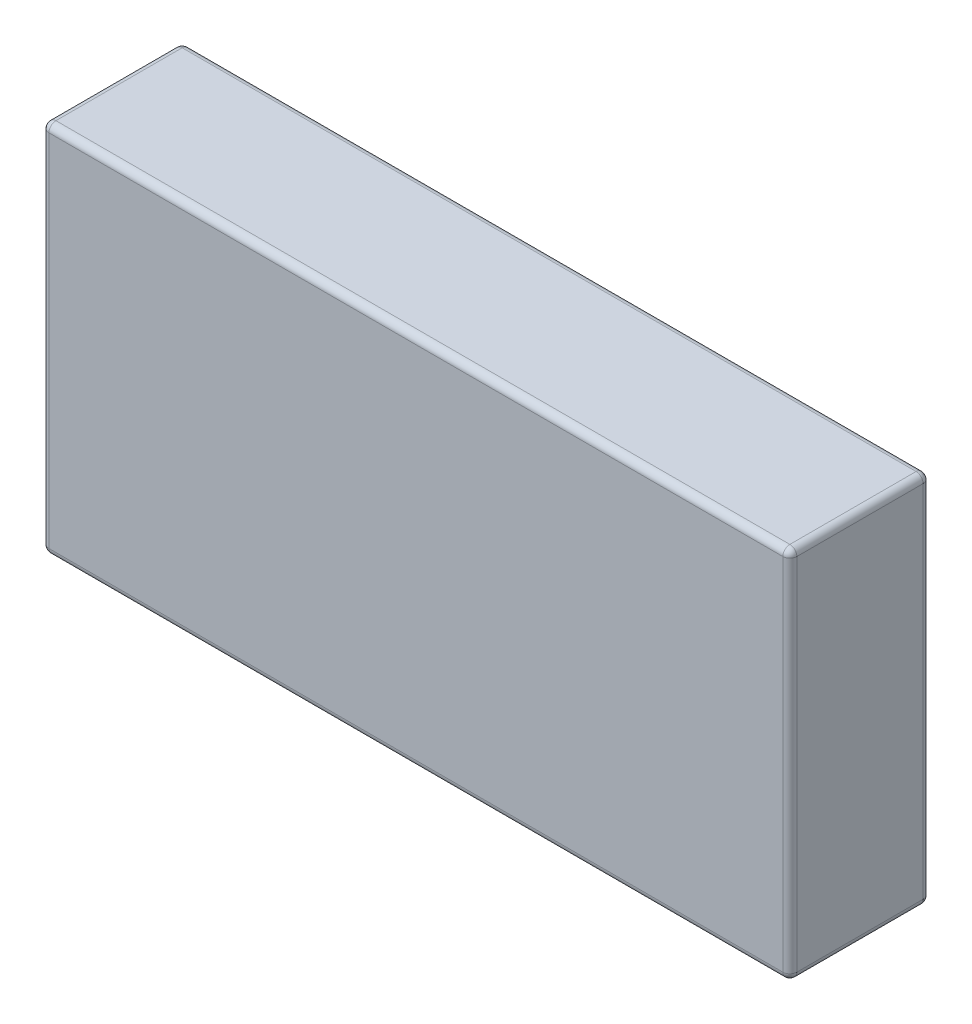
ISO-10303-21;
HEADER;
FILE_DESCRIPTION(('STEP AP214'),'2;1');
FILE_NAME('part.step','',(''),(''),'','','');
FILE_SCHEMA(('AUTOMOTIVE_DESIGN { 1 0 10303 214 1 1 1 1 }'));
ENDSEC;
DATA;
#1=APPLICATION_CONTEXT('core data for automotive mechanical design processes');
#2=APPLICATION_PROTOCOL_DEFINITION('international standard','automotive_design',2000,#1);
#3=PRODUCT_CONTEXT('',#1,'mechanical');
#4=PRODUCT('Part','Part','',(#3));
#5=PRODUCT_RELATED_PRODUCT_CATEGORY('part','',(#4));
#6=PRODUCT_DEFINITION_FORMATION('','',#4);
#7=PRODUCT_DEFINITION_CONTEXT('part definition',#1,'design');
#8=PRODUCT_DEFINITION('design','',#6,#7);
#9=PRODUCT_DEFINITION_SHAPE('','',#8);
#10=(LENGTH_UNIT() NAMED_UNIT(*) SI_UNIT(.MILLI.,.METRE.));
#11=(NAMED_UNIT(*) PLANE_ANGLE_UNIT() SI_UNIT($,.RADIAN.));
#12=(NAMED_UNIT(*) SI_UNIT($,.STERADIAN.) SOLID_ANGLE_UNIT());
#13=UNCERTAINTY_MEASURE_WITH_UNIT(LENGTH_MEASURE(1.E-05),#10,'distance_accuracy_value','');
#14=(GEOMETRIC_REPRESENTATION_CONTEXT(3) GLOBAL_UNCERTAINTY_ASSIGNED_CONTEXT((#13)) GLOBAL_UNIT_ASSIGNED_CONTEXT((#10,
#11,#12)) REPRESENTATION_CONTEXT('',''));
#15=CARTESIAN_POINT('',(0.,0.,0.));
#16=DIRECTION('',(0.,0.,1.));
#17=DIRECTION('',(1.,0.,0.));
#18=AXIS2_PLACEMENT_3D('',#15,#16,#17);
#19=CARTESIAN_POINT('',(-0.784999999999999,0.384999999999998,0.0150000000000006));
#20=DIRECTION('',(1.,0.,0.));
#21=DIRECTION('',(0.,0.,-1.));
#22=AXIS2_PLACEMENT_3D('',#19,#20,#21);
#23=SPHERICAL_SURFACE('',#22,0.0150000000000025);
#24=CARTESIAN_POINT('',(-0.784999999999998,0.385,0.0150000000000019));
#25=DIRECTION('',(0.,1.,0.));
#26=DIRECTION('',(0.,0.,1.));
#27=AXIS2_PLACEMENT_3D('',#24,#25,#26);
#28=CIRCLE('',#27,0.0150000000000028);
#29=CARTESIAN_POINT('',(-0.800000000000001,0.384999999999999,0.0150000000000003));
#30=VERTEX_POINT('',#29);
#31=CARTESIAN_POINT('',(-0.785,0.385,0.));
#32=VERTEX_POINT('',#31);
#33=EDGE_CURVE('E160',#30,#32,#28,.F.);
#34=ORIENTED_EDGE('',*,*,#33,.F.);
#35=CARTESIAN_POINT('',(-0.785,0.385,0.015));
#36=DIRECTION('',(0.,0.,1.));
#37=DIRECTION('',(1.,0.,0.));
#38=AXIS2_PLACEMENT_3D('',#35,#36,#37);
#39=CIRCLE('',#38,0.0150000000000007);
#40=CARTESIAN_POINT('',(-0.785,0.4,0.0149999999995748));
#41=VERTEX_POINT('',#40);
#42=EDGE_CURVE('E278',#41,#30,#39,.T.);
#43=ORIENTED_EDGE('',*,*,#42,.F.);
#44=CARTESIAN_POINT('',(-0.785,0.385000000000001,0.0149999999999986));
#45=DIRECTION('',(1.,0.,0.));
#46=DIRECTION('',(0.,0.,-1.));
#47=AXIS2_PLACEMENT_3D('',#44,#45,#46);
#48=CIRCLE('',#47,0.0149999999999985);
#49=EDGE_CURVE('E284',#32,#41,#48,.T.);
#50=ORIENTED_EDGE('',*,*,#49,.F.);
#51=EDGE_LOOP('',(#34,#43,#50));
#52=FACE_BOUND('',#51,.T.);
#53=ADVANCED_FACE('F17',(#52),#23,.T.);
#54=CARTESIAN_POINT('',(0.785000000000001,0.385,0.0149999999999997));
#55=DIRECTION('',(1.,0.,0.));
#56=DIRECTION('',(0.,0.,-1.));
#57=AXIS2_PLACEMENT_3D('',#54,#55,#56);
#58=SPHERICAL_SURFACE('',#57,0.0149999999999998);
#59=CARTESIAN_POINT('',(0.784999999999998,0.385,0.0150000000000019));
#60=DIRECTION('',(0.,-1.,0.));
#61=DIRECTION('',(0.,0.,-1.));
#62=AXIS2_PLACEMENT_3D('',#59,#60,#61);
#63=CIRCLE('',#62,0.0150000000000028);
#64=CARTESIAN_POINT('',(0.784999999999999,0.385,0.));
#65=VERTEX_POINT('',#64);
#66=CARTESIAN_POINT('',(0.800000000000001,0.385000000000001,0.0149999999999998));
#67=VERTEX_POINT('',#66);
#68=EDGE_CURVE('E113',#65,#67,#63,.T.);
#69=ORIENTED_EDGE('',*,*,#68,.F.);
#70=CARTESIAN_POINT('',(0.785,0.385000000000001,0.0149999999999986));
#71=DIRECTION('',(1.,0.,0.));
#72=DIRECTION('',(0.,0.,-1.));
#73=AXIS2_PLACEMENT_3D('',#70,#71,#72);
#74=CIRCLE('',#73,0.0149999999999985);
#75=CARTESIAN_POINT('',(0.784999999999999,0.4,0.015));
#76=VERTEX_POINT('',#75);
#77=EDGE_CURVE('E281',#76,#65,#74,.F.);
#78=ORIENTED_EDGE('',*,*,#77,.F.);
#79=CARTESIAN_POINT('',(0.785000000000001,0.385000000000001,0.015));
#80=DIRECTION('',(0.,0.,1.));
#81=DIRECTION('',(1.,0.,0.));
#82=AXIS2_PLACEMENT_3D('',#79,#80,#81);
#83=CIRCLE('',#82,0.0149999999999988);
#84=EDGE_CURVE('E275',#67,#76,#83,.T.);
#85=ORIENTED_EDGE('',*,*,#84,.F.);
#86=EDGE_LOOP('',(#69,#78,#85));
#87=FACE_BOUND('',#86,.T.);
#88=ADVANCED_FACE('F162',(#87),#58,.T.);
#89=CARTESIAN_POINT('',(-0.784999999999998,0.385,0.0150000000000019));
#90=DIRECTION('',(0.,1.,0.));
#91=DIRECTION('',(0.,0.,1.));
#92=AXIS2_PLACEMENT_3D('',#89,#90,#91);
#93=CYLINDRICAL_SURFACE('',#92,0.0150000000000028);
#94=ORIENTED_EDGE('',*,*,#33,.T.);
#95=DIRECTION('',(0.,1.,0.));
#96=VECTOR('',#95,1.);
#97=CARTESIAN_POINT('',(-0.785,0.385,0.));
#98=LINE('',#97,#96);
#99=CARTESIAN_POINT('',(-0.785,-0.385000000000402,0.));
#100=VERTEX_POINT('',#99);
#101=EDGE_CURVE('E136',#100,#32,#98,.T.);
#102=ORIENTED_EDGE('',*,*,#101,.F.);
#103=CARTESIAN_POINT('',(-0.784999999999999,-0.384999999999999,0.0150000000000005));
#104=DIRECTION('',(0.,1.,-1.0727817927293E-10));
#105=DIRECTION('',(1.,0.,0.));
#106=AXIS2_PLACEMENT_3D('',#103,#104,#105);
#107=CIRCLE('',#106,0.015000000000001);
#108=CARTESIAN_POINT('',(-0.8,-0.385,0.0150000000000001));
#109=VERTEX_POINT('',#108);
#110=EDGE_CURVE('E138',#109,#100,#107,.F.);
#111=ORIENTED_EDGE('',*,*,#110,.F.);
#112=DIRECTION('',(0.,1.,0.));
#113=VECTOR('',#112,1.);
#114=CARTESIAN_POINT('',(-0.800000000000001,-0.385,0.015));
#115=LINE('',#114,#113);
#116=EDGE_CURVE('E269',#30,#109,#115,.F.);
#117=ORIENTED_EDGE('',*,*,#116,.F.);
#118=EDGE_LOOP('',(#94,#102,#111,#117));
#119=FACE_BOUND('',#118,.T.);
#120=ADVANCED_FACE('F154',(#119),#93,.T.);
#121=CARTESIAN_POINT('',(-0.784999999999999,-0.384999999999999,0.0150000000000005));
#122=DIRECTION('',(1.,0.,0.));
#123=DIRECTION('',(0.,0.,1.));
#124=AXIS2_PLACEMENT_3D('',#121,#122,#123);
#125=SPHERICAL_SURFACE('',#124,0.015000000000001);
#126=CARTESIAN_POINT('',(-0.784999999999999,-0.384999999999999,0.015));
#127=DIRECTION('',(0.,0.,1.));
#128=DIRECTION('',(1.,0.,0.));
#129=AXIS2_PLACEMENT_3D('',#126,#127,#128);
#130=CIRCLE('',#129,0.0150000000000009);
#131=CARTESIAN_POINT('',(-0.785,-0.4,0.015));
#132=VERTEX_POINT('',#131);
#133=EDGE_CURVE('E266',#109,#132,#130,.T.);
#134=ORIENTED_EDGE('',*,*,#133,.F.);
#135=ORIENTED_EDGE('',*,*,#110,.T.);
#136=CARTESIAN_POINT('',(-0.785,-0.385,0.0150000000000006));
#137=DIRECTION('',(-1.,0.,0.));
#138=DIRECTION('',(0.,0.,1.));
#139=AXIS2_PLACEMENT_3D('',#136,#137,#138);
#140=CIRCLE('',#139,0.0150000000000007);
#141=EDGE_CURVE('E124',#132,#100,#140,.F.);
#142=ORIENTED_EDGE('',*,*,#141,.F.);
#143=EDGE_LOOP('',(#134,#135,#142));
#144=FACE_BOUND('',#143,.T.);
#145=ADVANCED_FACE('F151',(#144),#125,.T.);
#146=CARTESIAN_POINT('',(0.4,0.385,0.));
#147=DIRECTION('',(0.,0.,-1.));
#148=DIRECTION('',(-1.,0.,0.));
#149=AXIS2_PLACEMENT_3D('',#146,#147,#148);
#150=PLANE('',#149);
#151=DIRECTION('',(0.,-1.,0.));
#152=VECTOR('',#151,1.);
#153=CARTESIAN_POINT('',(0.784999999999998,-0.385,0.));
#154=LINE('',#153,#152);
#155=CARTESIAN_POINT('',(0.784999999999999,-0.385,0.));
#156=VERTEX_POINT('',#155);
#157=EDGE_CURVE('E105',#156,#65,#154,.F.);
#158=ORIENTED_EDGE('',*,*,#157,.F.);
#159=DIRECTION('',(-1.,0.,0.));
#160=VECTOR('',#159,1.);
#161=CARTESIAN_POINT('',(0.4,-0.385,0.));
#162=LINE('',#161,#160);
#163=EDGE_CURVE('E108',#100,#156,#162,.F.);
#164=ORIENTED_EDGE('',*,*,#163,.F.);
#165=ORIENTED_EDGE('',*,*,#101,.T.);
#166=DIRECTION('',(1.,0.,0.));
#167=VECTOR('',#166,1.);
#168=CARTESIAN_POINT('',(0.785,0.385000000000001,0.));
#169=LINE('',#168,#167);
#170=EDGE_CURVE('E102',#65,#32,#169,.F.);
#171=ORIENTED_EDGE('',*,*,#170,.F.);
#172=EDGE_LOOP('',(#158,#164,#165,#171));
#173=FACE_BOUND('',#172,.T.);
#174=ADVANCED_FACE('F107',(#173),#150,.T.);
#175=CARTESIAN_POINT('',(0.785,-0.384999999999999,0.0150000000000006));
#176=DIRECTION('',(1.,0.,0.));
#177=DIRECTION('',(0.,0.,1.));
#178=AXIS2_PLACEMENT_3D('',#175,#176,#177);
#179=SPHERICAL_SURFACE('',#178,0.015000000000001);
#180=CARTESIAN_POINT('',(0.784999999999997,-0.384999999999997,0.015));
#181=DIRECTION('',(0.,0.,1.));
#182=DIRECTION('',(1.,0.,0.));
#183=AXIS2_PLACEMENT_3D('',#180,#181,#182);
#184=CIRCLE('',#183,0.0150000000000038);
#185=CARTESIAN_POINT('',(0.785,-0.4,0.0149999999995748));
#186=VERTEX_POINT('',#185);
#187=CARTESIAN_POINT('',(0.800000000000001,-0.384999999999999,0.0150000000000003));
#188=VERTEX_POINT('',#187);
#189=EDGE_CURVE('E129',#186,#188,#184,.T.);
#190=ORIENTED_EDGE('',*,*,#189,.F.);
#191=CARTESIAN_POINT('',(0.785,-0.385,0.0150000000000006));
#192=DIRECTION('',(-1.,0.,0.));
#193=DIRECTION('',(0.,0.,1.));
#194=AXIS2_PLACEMENT_3D('',#191,#192,#193);
#195=CIRCLE('',#194,0.0150000000000007);
#196=EDGE_CURVE('E121',#156,#186,#195,.T.);
#197=ORIENTED_EDGE('',*,*,#196,.F.);
#198=CARTESIAN_POINT('',(0.784999999999998,-0.385,0.0150000000000019));
#199=DIRECTION('',(0.,-1.,0.));
#200=DIRECTION('',(0.,0.,-1.));
#201=AXIS2_PLACEMENT_3D('',#198,#199,#200);
#202=CIRCLE('',#201,0.0150000000000028);
#203=EDGE_CURVE('E114',#188,#156,#202,.F.);
#204=ORIENTED_EDGE('',*,*,#203,.F.);
#205=EDGE_LOOP('',(#190,#197,#204));
#206=FACE_BOUND('',#205,.T.);
#207=ADVANCED_FACE('F127',(#206),#179,.T.);
#208=CARTESIAN_POINT('',(0.784999999999998,-0.385,0.0150000000000019));
#209=DIRECTION('',(0.,-1.,0.));
#210=DIRECTION('',(0.,0.,-1.));
#211=AXIS2_PLACEMENT_3D('',#208,#209,#210);
#212=CYLINDRICAL_SURFACE('',#211,0.0150000000000028);
#213=ORIENTED_EDGE('',*,*,#68,.T.);
#214=DIRECTION('',(0.,1.,0.));
#215=VECTOR('',#214,1.);
#216=CARTESIAN_POINT('',(0.800000000000001,0.385,0.015));
#217=LINE('',#216,#215);
#218=EDGE_CURVE('E134',#188,#67,#217,.T.);
#219=ORIENTED_EDGE('',*,*,#218,.F.);
#220=ORIENTED_EDGE('',*,*,#203,.T.);
#221=ORIENTED_EDGE('',*,*,#157,.T.);
#222=EDGE_LOOP('',(#213,#219,#220,#221));
#223=FACE_BOUND('',#222,.T.);
#224=ADVANCED_FACE('F132',(#223),#212,.T.);
#225=CARTESIAN_POINT('',(0.785,0.385000000000001,0.0149999999999986));
#226=DIRECTION('',(1.,0.,0.));
#227=DIRECTION('',(0.,0.,-1.));
#228=AXIS2_PLACEMENT_3D('',#225,#226,#227);
#229=CYLINDRICAL_SURFACE('',#228,0.0149999999999985);
#230=DIRECTION('',(1.,0.,0.));
#231=VECTOR('',#230,1.);
#232=CARTESIAN_POINT('',(-0.785,0.4,0.015));
#233=LINE('',#232,#231);
#234=EDGE_CURVE('E249',#76,#41,#233,.F.);
#235=ORIENTED_EDGE('',*,*,#234,.F.);
#236=ORIENTED_EDGE('',*,*,#77,.T.);
#237=ORIENTED_EDGE('',*,*,#170,.T.);
#238=ORIENTED_EDGE('',*,*,#49,.T.);
#239=EDGE_LOOP('',(#235,#236,#237,#238));
#240=FACE_BOUND('',#239,.T.);
#241=ADVANCED_FACE('F353',(#240),#229,.T.);
#242=CARTESIAN_POINT('',(-0.785,0.385,0.285));
#243=DIRECTION('',(0.,0.,1.));
#244=DIRECTION('',(1.,0.,0.));
#245=AXIS2_PLACEMENT_3D('',#242,#243,#244);
#246=CYLINDRICAL_SURFACE('',#245,0.0150000000000007);
#247=ORIENTED_EDGE('',*,*,#42,.T.);
#248=DIRECTION('',(0.,0.,1.));
#249=VECTOR('',#248,1.);
#250=CARTESIAN_POINT('',(-0.800000000000001,0.385,0.015));
#251=LINE('',#250,#249);
#252=CARTESIAN_POINT('',(-0.800000000000001,0.385,0.285));
#253=VERTEX_POINT('',#252);
#254=EDGE_CURVE('E272',#253,#30,#251,.F.);
#255=ORIENTED_EDGE('',*,*,#254,.F.);
#256=CARTESIAN_POINT('',(-0.785,0.385,0.285));
#257=DIRECTION('',(0.,0.,1.));
#258=DIRECTION('',(1.,0.,0.));
#259=AXIS2_PLACEMENT_3D('',#256,#257,#258);
#260=CIRCLE('',#259,0.0150000000000002);
#261=CARTESIAN_POINT('',(-0.785,0.4,0.285));
#262=VERTEX_POINT('',#261);
#263=EDGE_CURVE('E241',#262,#253,#260,.T.);
#264=ORIENTED_EDGE('',*,*,#263,.F.);
#265=DIRECTION('',(0.,0.,1.));
#266=VECTOR('',#265,1.);
#267=CARTESIAN_POINT('',(-0.785,0.4,0.015));
#268=LINE('',#267,#266);
#269=EDGE_CURVE('E246',#41,#262,#268,.T.);
#270=ORIENTED_EDGE('',*,*,#269,.F.);
#271=EDGE_LOOP('',(#247,#255,#264,#270));
#272=FACE_BOUND('',#271,.T.);
#273=ADVANCED_FACE('F357',(#272),#246,.T.);
#274=CARTESIAN_POINT('',(0.785000000000001,0.385000000000001,0.285));
#275=DIRECTION('',(0.,0.,1.));
#276=DIRECTION('',(1.,0.,0.));
#277=AXIS2_PLACEMENT_3D('',#274,#275,#276);
#278=CYLINDRICAL_SURFACE('',#277,0.0149999999999988);
#279=ORIENTED_EDGE('',*,*,#84,.T.);
#280=DIRECTION('',(0.,0.,1.));
#281=VECTOR('',#280,1.);
#282=CARTESIAN_POINT('',(0.785,0.4,0.015));
#283=LINE('',#282,#281);
#284=CARTESIAN_POINT('',(0.785,0.4,0.285));
#285=VERTEX_POINT('',#284);
#286=EDGE_CURVE('E252',#285,#76,#283,.F.);
#287=ORIENTED_EDGE('',*,*,#286,.F.);
#288=CARTESIAN_POINT('',(0.785,0.384999999999999,0.285));
#289=DIRECTION('',(0.,0.,1.));
#290=DIRECTION('',(1.,0.,0.));
#291=AXIS2_PLACEMENT_3D('',#288,#289,#290);
#292=CIRCLE('',#291,0.0150000000000009);
#293=CARTESIAN_POINT('',(0.8,0.385,0.285));
#294=VERTEX_POINT('',#293);
#295=EDGE_CURVE('E239',#294,#285,#292,.T.);
#296=ORIENTED_EDGE('',*,*,#295,.F.);
#297=DIRECTION('',(0.,0.,-1.));
#298=VECTOR('',#297,1.);
#299=CARTESIAN_POINT('',(0.800000000000001,0.385,0.015));
#300=LINE('',#299,#298);
#301=EDGE_CURVE('E255',#67,#294,#300,.F.);
#302=ORIENTED_EDGE('',*,*,#301,.F.);
#303=EDGE_LOOP('',(#279,#287,#296,#302));
#304=FACE_BOUND('',#303,.T.);
#305=ADVANCED_FACE('F290',(#304),#278,.T.);
#306=CARTESIAN_POINT('',(-0.800000000000001,-0.385,0.015));
#307=DIRECTION('',(-1.,0.,0.));
#308=DIRECTION('',(0.,0.,1.));
#309=AXIS2_PLACEMENT_3D('',#306,#307,#308);
#310=PLANE('',#309);
#311=ORIENTED_EDGE('',*,*,#116,.T.);
#312=DIRECTION('',(0.,0.,1.));
#313=VECTOR('',#312,1.);
#314=CARTESIAN_POINT('',(-0.8,-0.385,0.285));
#315=LINE('',#314,#313);
#316=CARTESIAN_POINT('',(-0.800000000000001,-0.385,0.285));
#317=VERTEX_POINT('',#316);
#318=EDGE_CURVE('E263',#317,#109,#315,.F.);
#319=ORIENTED_EDGE('',*,*,#318,.F.);
#320=DIRECTION('',(0.,-1.,0.));
#321=VECTOR('',#320,1.);
#322=CARTESIAN_POINT('',(-0.800000000000001,-0.385,0.285));
#323=LINE('',#322,#321);
#324=EDGE_CURVE('E340',#253,#317,#323,.T.);
#325=ORIENTED_EDGE('',*,*,#324,.F.);
#326=ORIENTED_EDGE('',*,*,#254,.T.);
#327=EDGE_LOOP('',(#311,#319,#325,#326));
#328=FACE_BOUND('',#327,.T.);
#329=ADVANCED_FACE('F359',(#328),#310,.T.);
#330=CARTESIAN_POINT('',(-0.784999999999999,-0.384999999999999,0.285));
#331=DIRECTION('',(0.,0.,1.));
#332=DIRECTION('',(1.,0.,0.));
#333=AXIS2_PLACEMENT_3D('',#330,#331,#332);
#334=CYLINDRICAL_SURFACE('',#333,0.0150000000000009);
#335=CARTESIAN_POINT('',(-0.784999999999999,-0.384999999999999,0.285));
#336=DIRECTION('',(0.,0.,-1.));
#337=DIRECTION('',(1.,0.,0.));
#338=AXIS2_PLACEMENT_3D('',#335,#336,#337);
#339=CIRCLE('',#338,0.0150000000000015);
#340=CARTESIAN_POINT('',(-0.785,-0.4,0.285));
#341=VERTEX_POINT('',#340);
#342=EDGE_CURVE('E344',#317,#341,#339,.F.);
#343=ORIENTED_EDGE('',*,*,#342,.F.);
#344=ORIENTED_EDGE('',*,*,#318,.T.);
#345=ORIENTED_EDGE('',*,*,#133,.T.);
#346=DIRECTION('',(0.,0.,-1.));
#347=VECTOR('',#346,1.);
#348=CARTESIAN_POINT('',(-0.785,-0.4,0.015));
#349=LINE('',#348,#347);
#350=EDGE_CURVE('E211',#341,#132,#349,.T.);
#351=ORIENTED_EDGE('',*,*,#350,.F.);
#352=EDGE_LOOP('',(#343,#344,#345,#351));
#353=FACE_BOUND('',#352,.T.);
#354=ADVANCED_FACE('F347',(#353),#334,.T.);
#355=CARTESIAN_POINT('',(0.4,-0.385,0.0150000000000006));
#356=DIRECTION('',(-1.,0.,0.));
#357=DIRECTION('',(0.,0.,1.));
#358=AXIS2_PLACEMENT_3D('',#355,#356,#357);
#359=CYLINDRICAL_SURFACE('',#358,0.0150000000000007);
#360=ORIENTED_EDGE('',*,*,#163,.T.);
#361=ORIENTED_EDGE('',*,*,#196,.T.);
#362=DIRECTION('',(1.,0.,0.));
#363=VECTOR('',#362,1.);
#364=CARTESIAN_POINT('',(0.785,-0.4,0.015));
#365=LINE('',#364,#363);
#366=EDGE_CURVE('E208',#132,#186,#365,.T.);
#367=ORIENTED_EDGE('',*,*,#366,.F.);
#368=ORIENTED_EDGE('',*,*,#141,.T.);
#369=EDGE_LOOP('',(#360,#361,#367,#368));
#370=FACE_BOUND('',#369,.T.);
#371=ADVANCED_FACE('F120',(#370),#359,.T.);
#372=CARTESIAN_POINT('',(0.784999999999997,-0.384999999999997,0.285));
#373=DIRECTION('',(0.,0.,1.));
#374=DIRECTION('',(1.,0.,0.));
#375=AXIS2_PLACEMENT_3D('',#372,#373,#374);
#376=CYLINDRICAL_SURFACE('',#375,0.0150000000000038);
#377=ORIENTED_EDGE('',*,*,#189,.T.);
#378=DIRECTION('',(0.,0.,-1.));
#379=VECTOR('',#378,1.);
#380=CARTESIAN_POINT('',(0.800000000000001,-0.385,0.015));
#381=LINE('',#380,#379);
#382=CARTESIAN_POINT('',(0.800000000000001,-0.384999999999998,0.285));
#383=VERTEX_POINT('',#382);
#384=EDGE_CURVE('E259',#383,#188,#381,.T.);
#385=ORIENTED_EDGE('',*,*,#384,.F.);
#386=CARTESIAN_POINT('',(0.785,-0.384999999999999,0.284999999999999));
#387=DIRECTION('',(0.,0.,-1.));
#388=DIRECTION('',(1.,0.,0.));
#389=AXIS2_PLACEMENT_3D('',#386,#387,#388);
#390=CIRCLE('',#389,0.0150000000000019);
#391=CARTESIAN_POINT('',(0.785,-0.400000000000001,0.285));
#392=VERTEX_POINT('',#391);
#393=EDGE_CURVE('E202',#392,#383,#390,.F.);
#394=ORIENTED_EDGE('',*,*,#393,.F.);
#395=DIRECTION('',(0.,0.,-1.));
#396=VECTOR('',#395,1.);
#397=CARTESIAN_POINT('',(0.785,-0.4,0.015));
#398=LINE('',#397,#396);
#399=EDGE_CURVE('E205',#186,#392,#398,.F.);
#400=ORIENTED_EDGE('',*,*,#399,.F.);
#401=EDGE_LOOP('',(#377,#385,#394,#400));
#402=FACE_BOUND('',#401,.T.);
#403=ADVANCED_FACE('F300',(#402),#376,.T.);
#404=CARTESIAN_POINT('',(0.800000000000001,0.385,0.015));
#405=DIRECTION('',(1.,0.,0.));
#406=DIRECTION('',(0.,0.,-1.));
#407=AXIS2_PLACEMENT_3D('',#404,#405,#406);
#408=PLANE('',#407);
#409=ORIENTED_EDGE('',*,*,#301,.T.);
#410=DIRECTION('',(0.,1.,0.));
#411=VECTOR('',#410,1.);
#412=CARTESIAN_POINT('',(0.800000000000001,0.385,0.285));
#413=LINE('',#412,#411);
#414=EDGE_CURVE('E297',#383,#294,#413,.T.);
#415=ORIENTED_EDGE('',*,*,#414,.F.);
#416=ORIENTED_EDGE('',*,*,#384,.T.);
#417=ORIENTED_EDGE('',*,*,#218,.T.);
#418=EDGE_LOOP('',(#409,#415,#416,#417));
#419=FACE_BOUND('',#418,.T.);
#420=ADVANCED_FACE('F295',(#419),#408,.T.);
#421=CARTESIAN_POINT('',(-0.785,0.4,0.015));
#422=DIRECTION('',(0.,1.,0.));
#423=DIRECTION('',(0.,0.,1.));
#424=AXIS2_PLACEMENT_3D('',#421,#422,#423);
#425=PLANE('',#424);
#426=ORIENTED_EDGE('',*,*,#269,.T.);
#427=DIRECTION('',(-1.,0.,0.));
#428=VECTOR('',#427,1.);
#429=CARTESIAN_POINT('',(0.4,0.4,0.285));
#430=LINE('',#429,#428);
#431=EDGE_CURVE('E326',#285,#262,#430,.T.);
#432=ORIENTED_EDGE('',*,*,#431,.F.);
#433=ORIENTED_EDGE('',*,*,#286,.T.);
#434=ORIENTED_EDGE('',*,*,#234,.T.);
#435=EDGE_LOOP('',(#426,#432,#433,#434));
#436=FACE_BOUND('',#435,.T.);
#437=ADVANCED_FACE('F355',(#436),#425,.T.);
#438=CARTESIAN_POINT('',(-0.785,0.385,0.285));
#439=DIRECTION('',(1.,0.,0.));
#440=DIRECTION('',(0.,0.,-1.));
#441=AXIS2_PLACEMENT_3D('',#438,#439,#440);
#442=SPHERICAL_SURFACE('',#441,0.0150000000000002);
#443=CARTESIAN_POINT('',(-0.785,0.385000000000002,0.285000000000002));
#444=DIRECTION('',(-1.,0.,0.));
#445=DIRECTION('',(0.,0.,1.));
#446=AXIS2_PLACEMENT_3D('',#443,#444,#445);
#447=CIRCLE('',#446,0.0149999999999979);
#448=CARTESIAN_POINT('',(-0.785,0.385,0.3));
#449=VERTEX_POINT('',#448);
#450=EDGE_CURVE('E323',#262,#449,#447,.F.);
#451=ORIENTED_EDGE('',*,*,#450,.F.);
#452=ORIENTED_EDGE('',*,*,#263,.T.);
#453=CARTESIAN_POINT('',(-0.784999999999999,0.385,0.284999999999999));
#454=DIRECTION('',(0.,-1.,0.));
#455=DIRECTION('',(0.,0.,-1.));
#456=AXIS2_PLACEMENT_3D('',#453,#454,#455);
#457=CIRCLE('',#456,0.0150000000000022);
#458=EDGE_CURVE('E237',#449,#253,#457,.T.);
#459=ORIENTED_EDGE('',*,*,#458,.F.);
#460=EDGE_LOOP('',(#451,#452,#459));
#461=FACE_BOUND('',#460,.T.);
#462=ADVANCED_FACE('F230',(#461),#442,.T.);
#463=CARTESIAN_POINT('',(0.785,0.384999999999999,0.285));
#464=DIRECTION('',(1.,0.,0.));
#465=DIRECTION('',(0.,0.,-1.));
#466=AXIS2_PLACEMENT_3D('',#463,#464,#465);
#467=SPHERICAL_SURFACE('',#466,0.0150000000000009);
#468=ORIENTED_EDGE('',*,*,#295,.T.);
#469=CARTESIAN_POINT('',(0.785,0.385000000000002,0.285000000000002));
#470=DIRECTION('',(-1.,0.,0.));
#471=DIRECTION('',(0.,0.,1.));
#472=AXIS2_PLACEMENT_3D('',#469,#470,#471);
#473=CIRCLE('',#472,0.0149999999999979);
#474=CARTESIAN_POINT('',(0.785,0.385000000000001,0.300000000000001));
#475=VERTEX_POINT('',#474);
#476=EDGE_CURVE('E320',#475,#285,#473,.T.);
#477=ORIENTED_EDGE('',*,*,#476,.F.);
#478=CARTESIAN_POINT('',(0.784999999999999,0.385,0.284999999999999));
#479=DIRECTION('',(0.,1.,0.));
#480=DIRECTION('',(0.,0.,1.));
#481=AXIS2_PLACEMENT_3D('',#478,#479,#480);
#482=CIRCLE('',#481,0.0150000000000022);
#483=EDGE_CURVE('E329',#294,#475,#482,.F.);
#484=ORIENTED_EDGE('',*,*,#483,.F.);
#485=EDGE_LOOP('',(#468,#477,#484));
#486=FACE_BOUND('',#485,.T.);
#487=ADVANCED_FACE('F225',(#486),#467,.T.);
#488=CARTESIAN_POINT('',(-0.784999999999999,-0.385,0.284999999999999));
#489=DIRECTION('',(0.,-1.,0.));
#490=DIRECTION('',(0.,0.,-1.));
#491=AXIS2_PLACEMENT_3D('',#488,#489,#490);
#492=CYLINDRICAL_SURFACE('',#491,0.0150000000000022);
#493=ORIENTED_EDGE('',*,*,#458,.T.);
#494=ORIENTED_EDGE('',*,*,#324,.T.);
#495=CARTESIAN_POINT('',(-0.784999999999999,-0.384999999999999,0.285));
#496=DIRECTION('',(0.,-1.,0.));
#497=DIRECTION('',(1.,0.,0.));
#498=AXIS2_PLACEMENT_3D('',#495,#496,#497);
#499=CIRCLE('',#498,0.0150000000000015);
#500=CARTESIAN_POINT('',(-0.785,-0.385,0.300000000000001));
#501=VERTEX_POINT('',#500);
#502=EDGE_CURVE('E214',#501,#317,#499,.T.);
#503=ORIENTED_EDGE('',*,*,#502,.F.);
#504=DIRECTION('',(0.,1.,0.));
#505=VECTOR('',#504,1.);
#506=CARTESIAN_POINT('',(-0.785,0.385,0.3));
#507=LINE('',#506,#505);
#508=EDGE_CURVE('E315',#449,#501,#507,.F.);
#509=ORIENTED_EDGE('',*,*,#508,.F.);
#510=EDGE_LOOP('',(#493,#494,#503,#509));
#511=FACE_BOUND('',#510,.T.);
#512=ADVANCED_FACE('F221',(#511),#492,.T.);
#513=CARTESIAN_POINT('',(-0.784999999999999,-0.384999999999999,0.285));
#514=DIRECTION('',(1.,0.,0.));
#515=DIRECTION('',(0.,0.,1.));
#516=AXIS2_PLACEMENT_3D('',#513,#514,#515);
#517=SPHERICAL_SURFACE('',#516,0.0150000000000015);
#518=CARTESIAN_POINT('',(-0.785,-0.385,0.285));
#519=DIRECTION('',(1.,0.,0.));
#520=DIRECTION('',(0.,0.,-1.));
#521=AXIS2_PLACEMENT_3D('',#518,#519,#520);
#522=CIRCLE('',#521,0.015);
#523=EDGE_CURVE('E311',#501,#341,#522,.T.);
#524=ORIENTED_EDGE('',*,*,#523,.F.);
#525=ORIENTED_EDGE('',*,*,#502,.T.);
#526=ORIENTED_EDGE('',*,*,#342,.T.);
#527=EDGE_LOOP('',(#524,#525,#526));
#528=FACE_BOUND('',#527,.T.);
#529=ADVANCED_FACE('F218',(#528),#517,.T.);
#530=CARTESIAN_POINT('',(0.785,-0.4,0.015));
#531=DIRECTION('',(0.,-1.,0.));
#532=DIRECTION('',(0.,0.,-1.));
#533=AXIS2_PLACEMENT_3D('',#530,#531,#532);
#534=PLANE('',#533);
#535=ORIENTED_EDGE('',*,*,#399,.T.);
#536=DIRECTION('',(1.,0.,0.));
#537=VECTOR('',#536,1.);
#538=CARTESIAN_POINT('',(0.785,-0.4,0.285));
#539=LINE('',#538,#537);
#540=EDGE_CURVE('E307',#341,#392,#539,.T.);
#541=ORIENTED_EDGE('',*,*,#540,.F.);
#542=ORIENTED_EDGE('',*,*,#350,.T.);
#543=ORIENTED_EDGE('',*,*,#366,.T.);
#544=EDGE_LOOP('',(#535,#541,#542,#543));
#545=FACE_BOUND('',#544,.T.);
#546=ADVANCED_FACE('F194',(#545),#534,.T.);
#547=CARTESIAN_POINT('',(0.785,-0.384999999999999,0.284999999999999));
#548=DIRECTION('',(1.,0.,0.));
#549=DIRECTION('',(0.,0.,1.));
#550=AXIS2_PLACEMENT_3D('',#547,#548,#549);
#551=SPHERICAL_SURFACE('',#550,0.0150000000000019);
#552=ORIENTED_EDGE('',*,*,#393,.T.);
#553=CARTESIAN_POINT('',(0.784999999999999,-0.385,0.284999999999999));
#554=DIRECTION('',(0.,1.,0.));
#555=DIRECTION('',(0.,0.,1.));
#556=AXIS2_PLACEMENT_3D('',#553,#554,#555);
#557=CIRCLE('',#556,0.0150000000000022);
#558=CARTESIAN_POINT('',(0.785,-0.384999999999999,0.300000000000001));
#559=VERTEX_POINT('',#558);
#560=EDGE_CURVE('E200',#559,#383,#557,.T.);
#561=ORIENTED_EDGE('',*,*,#560,.F.);
#562=CARTESIAN_POINT('',(0.785,-0.385,0.285));
#563=DIRECTION('',(1.,0.,0.));
#564=DIRECTION('',(0.,0.,-1.));
#565=AXIS2_PLACEMENT_3D('',#562,#563,#564);
#566=CIRCLE('',#565,0.015);
#567=EDGE_CURVE('E303',#392,#559,#566,.F.);
#568=ORIENTED_EDGE('',*,*,#567,.F.);
#569=EDGE_LOOP('',(#552,#561,#568));
#570=FACE_BOUND('',#569,.T.);
#571=ADVANCED_FACE('F189',(#570),#551,.T.);
#572=CARTESIAN_POINT('',(0.784999999999999,0.385,0.284999999999999));
#573=DIRECTION('',(0.,1.,0.));
#574=DIRECTION('',(0.,0.,1.));
#575=AXIS2_PLACEMENT_3D('',#572,#573,#574);
#576=CYLINDRICAL_SURFACE('',#575,0.0150000000000022);
#577=ORIENTED_EDGE('',*,*,#483,.T.);
#578=DIRECTION('',(0.,1.,0.));
#579=VECTOR('',#578,1.);
#580=CARTESIAN_POINT('',(0.785,0.385,0.3));
#581=LINE('',#580,#579);
#582=EDGE_CURVE('E306',#559,#475,#581,.T.);
#583=ORIENTED_EDGE('',*,*,#582,.F.);
#584=ORIENTED_EDGE('',*,*,#560,.T.);
#585=ORIENTED_EDGE('',*,*,#414,.T.);
#586=EDGE_LOOP('',(#577,#583,#584,#585));
#587=FACE_BOUND('',#586,.T.);
#588=ADVANCED_FACE('F185',(#587),#576,.T.);
#589=CARTESIAN_POINT('',(0.4,0.385000000000002,0.285000000000002));
#590=DIRECTION('',(-1.,0.,0.));
#591=DIRECTION('',(0.,0.,1.));
#592=AXIS2_PLACEMENT_3D('',#589,#590,#591);
#593=CYLINDRICAL_SURFACE('',#592,0.0149999999999979);
#594=DIRECTION('',(1.,0.,0.));
#595=VECTOR('',#594,1.);
#596=CARTESIAN_POINT('',(-0.4,0.385,0.3));
#597=LINE('',#596,#595);
#598=EDGE_CURVE('E26',#475,#449,#597,.F.);
#599=ORIENTED_EDGE('',*,*,#598,.F.);
#600=ORIENTED_EDGE('',*,*,#476,.T.);
#601=ORIENTED_EDGE('',*,*,#431,.T.);
#602=ORIENTED_EDGE('',*,*,#450,.T.);
#603=EDGE_LOOP('',(#599,#600,#601,#602));
#604=FACE_BOUND('',#603,.T.);
#605=ADVANCED_FACE('F179',(#604),#593,.T.);
#606=CARTESIAN_POINT('',(0.785,-0.385,0.285));
#607=DIRECTION('',(1.,0.,0.));
#608=DIRECTION('',(0.,0.,-1.));
#609=AXIS2_PLACEMENT_3D('',#606,#607,#608);
#610=CYLINDRICAL_SURFACE('',#609,0.015);
#611=ORIENTED_EDGE('',*,*,#540,.T.);
#612=ORIENTED_EDGE('',*,*,#567,.T.);
#613=DIRECTION('',(1.,0.,0.));
#614=VECTOR('',#613,1.);
#615=CARTESIAN_POINT('',(-0.4,-0.385,0.3));
#616=LINE('',#615,#614);
#617=EDGE_CURVE('E11',#501,#559,#616,.T.);
#618=ORIENTED_EDGE('',*,*,#617,.F.);
#619=ORIENTED_EDGE('',*,*,#523,.T.);
#620=EDGE_LOOP('',(#611,#612,#618,#619));
#621=FACE_BOUND('',#620,.T.);
#622=ADVANCED_FACE('F174',(#621),#610,.T.);
#623=CARTESIAN_POINT('',(-0.4,-0.385,0.3));
#624=DIRECTION('',(0.,0.,1.));
#625=DIRECTION('',(1.,0.,0.));
#626=AXIS2_PLACEMENT_3D('',#623,#624,#625);
#627=PLANE('',#626);
#628=ORIENTED_EDGE('',*,*,#617,.T.);
#629=ORIENTED_EDGE('',*,*,#582,.T.);
#630=ORIENTED_EDGE('',*,*,#598,.T.);
#631=ORIENTED_EDGE('',*,*,#508,.T.);
#632=EDGE_LOOP('',(#628,#629,#630,#631));
#633=FACE_BOUND('',#632,.T.);
#634=ADVANCED_FACE('F172',(#633),#627,.T.);
#635=CLOSED_SHELL('',(#53,#88,#120,#145,#174,#207,#224,#241,#273,#305,#329,#354,#371,#403,#420,
#437,#462,#487,#512,#529,#546,#571,#588,#605,#622,#634));
#636=MANIFOLD_SOLID_BREP('B1',#635);
#637=ADVANCED_BREP_SHAPE_REPRESENTATION('',(#18,#636),#14);
#638=SHAPE_DEFINITION_REPRESENTATION(#9,#637);
ENDSEC;
END-ISO-10303-21;
